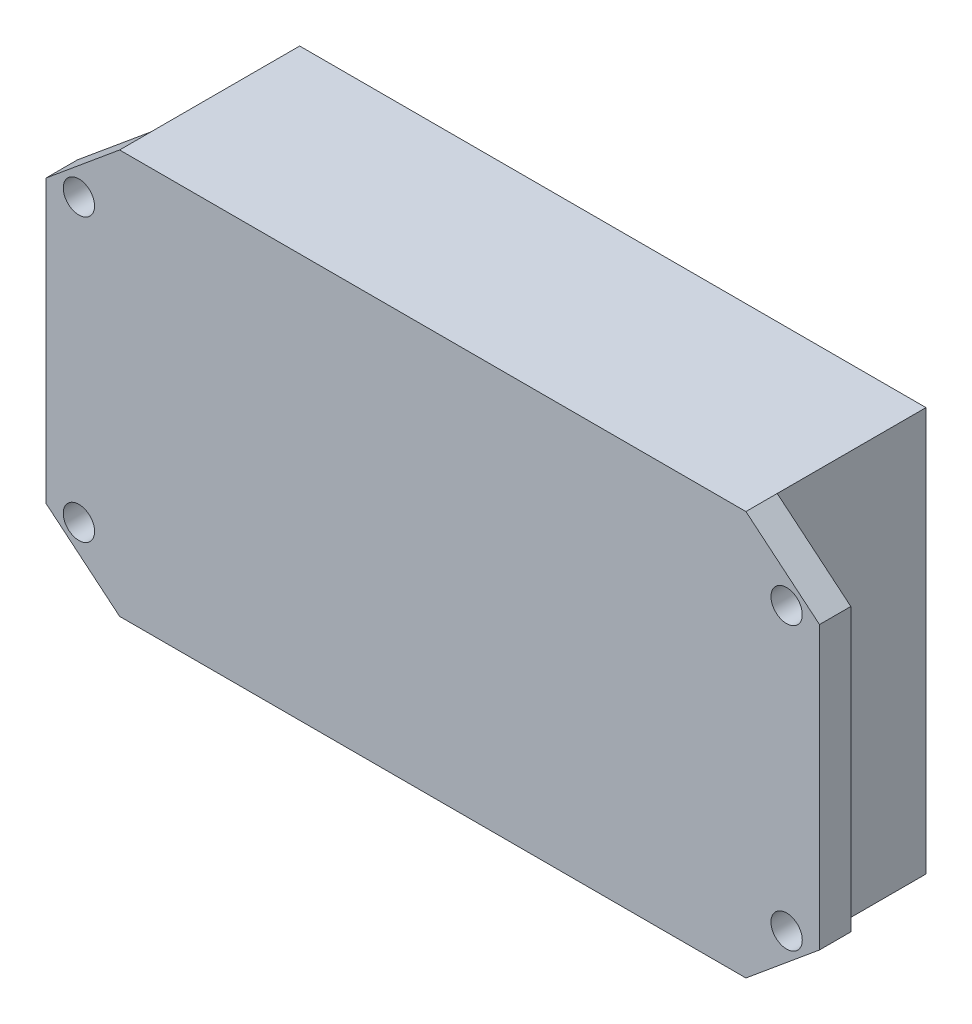
ISO-10303-21;
HEADER;
FILE_DESCRIPTION(('STEP AP214'),'2;1');
FILE_NAME('part.step','',(''),(''),'','','');
FILE_SCHEMA(('AUTOMOTIVE_DESIGN { 1 0 10303 214 1 1 1 1 }'));
ENDSEC;
DATA;
#1=APPLICATION_CONTEXT('core data for automotive mechanical design processes');
#2=APPLICATION_PROTOCOL_DEFINITION('international standard','automotive_design',2000,#1);
#3=PRODUCT_CONTEXT('',#1,'mechanical');
#4=PRODUCT('Part','Part','',(#3));
#5=PRODUCT_RELATED_PRODUCT_CATEGORY('part','',(#4));
#6=PRODUCT_DEFINITION_FORMATION('','',#4);
#7=PRODUCT_DEFINITION_CONTEXT('part definition',#1,'design');
#8=PRODUCT_DEFINITION('design','',#6,#7);
#9=PRODUCT_DEFINITION_SHAPE('','',#8);
#10=(LENGTH_UNIT() NAMED_UNIT(*) SI_UNIT(.MILLI.,.METRE.));
#11=(NAMED_UNIT(*) PLANE_ANGLE_UNIT() SI_UNIT($,.RADIAN.));
#12=(NAMED_UNIT(*) SI_UNIT($,.STERADIAN.) SOLID_ANGLE_UNIT());
#13=UNCERTAINTY_MEASURE_WITH_UNIT(LENGTH_MEASURE(1.E-05),#10,'distance_accuracy_value','');
#14=(GEOMETRIC_REPRESENTATION_CONTEXT(3) GLOBAL_UNCERTAINTY_ASSIGNED_CONTEXT((#13)) GLOBAL_UNIT_ASSIGNED_CONTEXT((#10,
#11,#12)) REPRESENTATION_CONTEXT('',''));
#15=CARTESIAN_POINT('',(0.,0.,0.));
#16=DIRECTION('',(0.,0.,1.));
#17=DIRECTION('',(1.,0.,0.));
#18=AXIS2_PLACEMENT_3D('',#15,#16,#17);
#19=CARTESIAN_POINT('',(20.,12.9,9.5));
#20=DIRECTION('',(-1.,0.,0.));
#21=DIRECTION('',(0.,0.,1.));
#22=AXIS2_PLACEMENT_3D('',#19,#20,#21);
#23=PLANE('',#22);
#24=DIRECTION('',(0.,1.,0.));
#25=VECTOR('',#24,1.);
#26=CARTESIAN_POINT('',(20.,12.9,0.));
#27=LINE('',#26,#25);
#28=CARTESIAN_POINT('',(20.,-12.9,0.));
#29=VERTEX_POINT('',#28);
#30=CARTESIAN_POINT('',(20.,12.9,0.));
#31=VERTEX_POINT('',#30);
#32=EDGE_CURVE('E146',#29,#31,#27,.T.);
#33=ORIENTED_EDGE('',*,*,#32,.T.);
#34=DIRECTION('',(0.,0.,-1.));
#35=VECTOR('',#34,1.);
#36=CARTESIAN_POINT('',(20.,12.9,9.5));
#37=LINE('',#36,#35);
#38=CARTESIAN_POINT('',(20.,12.9,9.5));
#39=VERTEX_POINT('',#38);
#40=EDGE_CURVE('E11',#39,#31,#37,.T.);
#41=ORIENTED_EDGE('',*,*,#40,.F.);
#42=DIRECTION('',(0.,1.,0.));
#43=VECTOR('',#42,1.);
#44=CARTESIAN_POINT('',(20.,12.9,9.5));
#45=LINE('',#44,#43);
#46=CARTESIAN_POINT('',(20.,-12.9,9.5));
#47=VERTEX_POINT('',#46);
#48=EDGE_CURVE('E154',#47,#39,#45,.T.);
#49=ORIENTED_EDGE('',*,*,#48,.F.);
#50=DIRECTION('',(0.,0.,-1.));
#51=VECTOR('',#50,1.);
#52=CARTESIAN_POINT('',(20.,-12.9,9.5));
#53=LINE('',#52,#51);
#54=EDGE_CURVE('E53',#47,#29,#53,.T.);
#55=ORIENTED_EDGE('',*,*,#54,.T.);
#56=EDGE_LOOP('',(#33,#41,#49,#55));
#57=FACE_BOUND('',#56,.T.);
#58=ADVANCED_FACE('F37',(#57),#23,.F.);
#59=CARTESIAN_POINT('',(-20.,12.9,9.5));
#60=DIRECTION('',(0.,-1.,0.));
#61=DIRECTION('',(0.,0.,-1.));
#62=AXIS2_PLACEMENT_3D('',#59,#60,#61);
#63=PLANE('',#62);
#64=DIRECTION('',(-1.,0.,0.));
#65=VECTOR('',#64,1.);
#66=CARTESIAN_POINT('',(-20.,12.9,0.));
#67=LINE('',#66,#65);
#68=CARTESIAN_POINT('',(-20.,12.9,0.));
#69=VERTEX_POINT('',#68);
#70=EDGE_CURVE('E148',#31,#69,#67,.T.);
#71=ORIENTED_EDGE('',*,*,#70,.T.);
#72=DIRECTION('',(0.,0.,-1.));
#73=VECTOR('',#72,1.);
#74=CARTESIAN_POINT('',(-20.,12.9,9.5));
#75=LINE('',#74,#73);
#76=CARTESIAN_POINT('',(-20.,12.9,9.5));
#77=VERTEX_POINT('',#76);
#78=EDGE_CURVE('E45',#77,#69,#75,.T.);
#79=ORIENTED_EDGE('',*,*,#78,.F.);
#80=DIRECTION('',(0.,0.,-1.));
#81=VECTOR('',#80,1.);
#82=CARTESIAN_POINT('',(-20.,12.9,11.5));
#83=LINE('',#82,#81);
#84=CARTESIAN_POINT('',(-20.,12.9,11.5));
#85=VERTEX_POINT('',#84);
#86=EDGE_CURVE('E198',#85,#77,#83,.T.);
#87=ORIENTED_EDGE('',*,*,#86,.F.);
#88=DIRECTION('',(-1.,0.,0.));
#89=VECTOR('',#88,1.);
#90=CARTESIAN_POINT('',(-20.,12.9,11.5));
#91=LINE('',#90,#89);
#92=CARTESIAN_POINT('',(20.,12.9,11.5));
#93=VERTEX_POINT('',#92);
#94=EDGE_CURVE('E137',#93,#85,#91,.T.);
#95=ORIENTED_EDGE('',*,*,#94,.F.);
#96=DIRECTION('',(0.,0.,-1.));
#97=VECTOR('',#96,1.);
#98=CARTESIAN_POINT('',(20.,12.9,11.5));
#99=LINE('',#98,#97);
#100=EDGE_CURVE('E200',#93,#39,#99,.T.);
#101=ORIENTED_EDGE('',*,*,#100,.T.);
#102=ORIENTED_EDGE('',*,*,#40,.T.);
#103=EDGE_LOOP('',(#71,#79,#87,#95,#101,#102));
#104=FACE_BOUND('',#103,.T.);
#105=ADVANCED_FACE('F265',(#104),#63,.F.);
#106=CARTESIAN_POINT('',(-20.,12.9,9.5));
#107=DIRECTION('',(1.,0.,0.));
#108=DIRECTION('',(0.,1.,0.));
#109=AXIS2_PLACEMENT_3D('',#106,#107,#108);
#110=PLANE('',#109);
#111=DIRECTION('',(0.,-1.,0.));
#112=VECTOR('',#111,1.);
#113=CARTESIAN_POINT('',(-20.,12.9,0.));
#114=LINE('',#113,#112);
#115=CARTESIAN_POINT('',(-20.,-12.9,0.));
#116=VERTEX_POINT('',#115);
#117=EDGE_CURVE('E72',#69,#116,#114,.T.);
#118=ORIENTED_EDGE('',*,*,#117,.T.);
#119=DIRECTION('',(0.,0.,-1.));
#120=VECTOR('',#119,1.);
#121=CARTESIAN_POINT('',(-20.,-12.9,9.5));
#122=LINE('',#121,#120);
#123=CARTESIAN_POINT('',(-20.,-12.9,9.5));
#124=VERTEX_POINT('',#123);
#125=EDGE_CURVE('E163',#124,#116,#122,.T.);
#126=ORIENTED_EDGE('',*,*,#125,.F.);
#127=DIRECTION('',(0.,-1.,0.));
#128=VECTOR('',#127,1.);
#129=CARTESIAN_POINT('',(-20.,12.9,9.5));
#130=LINE('',#129,#128);
#131=EDGE_CURVE('E156',#77,#124,#130,.T.);
#132=ORIENTED_EDGE('',*,*,#131,.F.);
#133=ORIENTED_EDGE('',*,*,#78,.T.);
#134=EDGE_LOOP('',(#118,#126,#132,#133));
#135=FACE_BOUND('',#134,.T.);
#136=ADVANCED_FACE('F165',(#135),#110,.F.);
#137=CARTESIAN_POINT('',(-20.,-12.9,9.5));
#138=DIRECTION('',(0.,1.,0.));
#139=DIRECTION('',(0.,0.,1.));
#140=AXIS2_PLACEMENT_3D('',#137,#138,#139);
#141=PLANE('',#140);
#142=DIRECTION('',(1.,0.,0.));
#143=VECTOR('',#142,1.);
#144=CARTESIAN_POINT('',(-20.,-12.9,0.));
#145=LINE('',#144,#143);
#146=EDGE_CURVE('E75',#116,#29,#145,.T.);
#147=ORIENTED_EDGE('',*,*,#146,.T.);
#148=ORIENTED_EDGE('',*,*,#54,.F.);
#149=DIRECTION('',(0.,0.,-1.));
#150=VECTOR('',#149,1.);
#151=CARTESIAN_POINT('',(20.,-12.9,11.5));
#152=LINE('',#151,#150);
#153=CARTESIAN_POINT('',(20.,-12.9,11.5));
#154=VERTEX_POINT('',#153);
#155=EDGE_CURVE('E177',#154,#47,#152,.T.);
#156=ORIENTED_EDGE('',*,*,#155,.F.);
#157=DIRECTION('',(1.,0.,0.));
#158=VECTOR('',#157,1.);
#159=CARTESIAN_POINT('',(-20.,-12.9,11.5));
#160=LINE('',#159,#158);
#161=CARTESIAN_POINT('',(-20.,-12.9,11.5));
#162=VERTEX_POINT('',#161);
#163=EDGE_CURVE('E209',#162,#154,#160,.T.);
#164=ORIENTED_EDGE('',*,*,#163,.F.);
#165=DIRECTION('',(0.,0.,-1.));
#166=VECTOR('',#165,1.);
#167=CARTESIAN_POINT('',(-20.,-12.9,11.5));
#168=LINE('',#167,#166);
#169=EDGE_CURVE('E150',#162,#124,#168,.T.);
#170=ORIENTED_EDGE('',*,*,#169,.T.);
#171=ORIENTED_EDGE('',*,*,#125,.T.);
#172=EDGE_LOOP('',(#147,#148,#156,#164,#170,#171));
#173=FACE_BOUND('',#172,.T.);
#174=ADVANCED_FACE('F208',(#173),#141,.F.);
#175=CARTESIAN_POINT('',(0.,0.,0.));
#176=DIRECTION('',(0.,0.,1.));
#177=DIRECTION('',(1.,0.,0.));
#178=AXIS2_PLACEMENT_3D('',#175,#176,#177);
#179=PLANE('',#178);
#180=ORIENTED_EDGE('',*,*,#32,.F.);
#181=ORIENTED_EDGE('',*,*,#146,.F.);
#182=ORIENTED_EDGE('',*,*,#117,.F.);
#183=ORIENTED_EDGE('',*,*,#70,.F.);
#184=EDGE_LOOP('',(#180,#181,#182,#183));
#185=FACE_BOUND('',#184,.T.);
#186=ADVANCED_FACE('F169',(#185),#179,.F.);
#187=CARTESIAN_POINT('',(0.,0.,9.5));
#188=DIRECTION('',(0.,0.,-1.));
#189=DIRECTION('',(-1.,0.,0.));
#190=AXIS2_PLACEMENT_3D('',#187,#188,#189);
#191=PLANE('',#190);
#192=CARTESIAN_POINT('',(22.6,9.,9.5));
#193=DIRECTION('',(0.,0.,1.));
#194=DIRECTION('',(-1.,0.,0.));
#195=AXIS2_PLACEMENT_3D('',#192,#193,#194);
#196=CIRCLE('',#195,0.999999999999998);
#197=CARTESIAN_POINT('',(21.6,9.,9.5));
#198=VERTEX_POINT('',#197);
#199=EDGE_CURVE('E233',#198,#198,#196,.T.);
#200=ORIENTED_EDGE('',*,*,#199,.T.);
#201=EDGE_LOOP('',(#200));
#202=FACE_BOUND('',#201,.T.);
#203=CARTESIAN_POINT('',(22.6,-9.,9.5));
#204=DIRECTION('',(0.,0.,1.));
#205=DIRECTION('',(1.,0.,0.));
#206=AXIS2_PLACEMENT_3D('',#203,#204,#205);
#207=CIRCLE('',#206,0.999999999999998);
#208=CARTESIAN_POINT('',(23.6,-9.,9.5));
#209=VERTEX_POINT('',#208);
#210=EDGE_CURVE('E239',#209,#209,#207,.T.);
#211=ORIENTED_EDGE('',*,*,#210,.T.);
#212=EDGE_LOOP('',(#211));
#213=FACE_BOUND('',#212,.T.);
#214=DIRECTION('',(0.769561694130098,0.638572469597315,0.));
#215=VECTOR('',#214,1.);
#216=CARTESIAN_POINT('',(20.,-12.9,9.5));
#217=LINE('',#216,#215);
#218=CARTESIAN_POINT('',(24.7,-9.,9.5));
#219=VERTEX_POINT('',#218);
#220=EDGE_CURVE('E180',#47,#219,#217,.T.);
#221=ORIENTED_EDGE('',*,*,#220,.F.);
#222=ORIENTED_EDGE('',*,*,#48,.T.);
#223=DIRECTION('',(-0.769561694130098,0.638572469597315,0.));
#224=VECTOR('',#223,1.);
#225=CARTESIAN_POINT('',(20.,12.9,9.5));
#226=LINE('',#225,#224);
#227=CARTESIAN_POINT('',(24.7,9.,9.5));
#228=VERTEX_POINT('',#227);
#229=EDGE_CURVE('E141',#228,#39,#226,.T.);
#230=ORIENTED_EDGE('',*,*,#229,.F.);
#231=DIRECTION('',(0.,1.,0.));
#232=VECTOR('',#231,1.);
#233=CARTESIAN_POINT('',(24.7,9.,9.5));
#234=LINE('',#233,#232);
#235=EDGE_CURVE('E188',#219,#228,#234,.T.);
#236=ORIENTED_EDGE('',*,*,#235,.F.);
#237=EDGE_LOOP('',(#221,#222,#230,#236));
#238=FACE_BOUND('',#237,.T.);
#239=ADVANCED_FACE('F187',(#202,#213,#238),#191,.T.);
#240=CARTESIAN_POINT('',(0.,0.,11.5));
#241=DIRECTION('',(0.,0.,-1.));
#242=DIRECTION('',(-1.,0.,0.));
#243=AXIS2_PLACEMENT_3D('',#240,#241,#242);
#244=PLANE('',#243);
#245=DIRECTION('',(-0.769561694130098,-0.638572469597315,0.));
#246=VECTOR('',#245,1.);
#247=CARTESIAN_POINT('',(-20.,12.9,11.5));
#248=LINE('',#247,#246);
#249=CARTESIAN_POINT('',(-24.7,9.,11.5));
#250=VERTEX_POINT('',#249);
#251=EDGE_CURVE('E131',#85,#250,#248,.T.);
#252=ORIENTED_EDGE('',*,*,#251,.T.);
#253=DIRECTION('',(0.,-1.,0.));
#254=VECTOR('',#253,1.);
#255=CARTESIAN_POINT('',(-24.7,9.,11.5));
#256=LINE('',#255,#254);
#257=CARTESIAN_POINT('',(-24.7,-9.,11.5));
#258=VERTEX_POINT('',#257);
#259=EDGE_CURVE('E120',#250,#258,#256,.T.);
#260=ORIENTED_EDGE('',*,*,#259,.T.);
#261=DIRECTION('',(0.769561694130098,-0.638572469597315,0.));
#262=VECTOR('',#261,1.);
#263=CARTESIAN_POINT('',(-20.,-12.9,11.5));
#264=LINE('',#263,#262);
#265=EDGE_CURVE('E130',#258,#162,#264,.T.);
#266=ORIENTED_EDGE('',*,*,#265,.T.);
#267=ORIENTED_EDGE('',*,*,#163,.T.);
#268=DIRECTION('',(0.769561694130098,0.638572469597315,0.));
#269=VECTOR('',#268,1.);
#270=CARTESIAN_POINT('',(20.,-12.9,11.5));
#271=LINE('',#270,#269);
#272=CARTESIAN_POINT('',(24.7,-9.,11.5));
#273=VERTEX_POINT('',#272);
#274=EDGE_CURVE('E182',#154,#273,#271,.T.);
#275=ORIENTED_EDGE('',*,*,#274,.T.);
#276=DIRECTION('',(0.,1.,0.));
#277=VECTOR('',#276,1.);
#278=CARTESIAN_POINT('',(24.7,9.,11.5));
#279=LINE('',#278,#277);
#280=CARTESIAN_POINT('',(24.7,9.,11.5));
#281=VERTEX_POINT('',#280);
#282=EDGE_CURVE('E225',#273,#281,#279,.T.);
#283=ORIENTED_EDGE('',*,*,#282,.T.);
#284=DIRECTION('',(-0.769561694130098,0.638572469597315,0.));
#285=VECTOR('',#284,1.);
#286=CARTESIAN_POINT('',(20.,12.9,11.5));
#287=LINE('',#286,#285);
#288=EDGE_CURVE('E223',#281,#93,#287,.T.);
#289=ORIENTED_EDGE('',*,*,#288,.T.);
#290=ORIENTED_EDGE('',*,*,#94,.T.);
#291=EDGE_LOOP('',(#252,#260,#266,#267,#275,#283,#289,#290));
#292=FACE_BOUND('',#291,.T.);
#293=CARTESIAN_POINT('',(-22.6,9.,11.5));
#294=DIRECTION('',(0.,0.,1.));
#295=DIRECTION('',(1.,0.,0.));
#296=AXIS2_PLACEMENT_3D('',#293,#294,#295);
#297=CIRCLE('',#296,0.999999999999998);
#298=CARTESIAN_POINT('',(-21.6,9.,11.5));
#299=VERTEX_POINT('',#298);
#300=EDGE_CURVE('E216',#299,#299,#297,.T.);
#301=ORIENTED_EDGE('',*,*,#300,.F.);
#302=EDGE_LOOP('',(#301));
#303=FACE_BOUND('',#302,.T.);
#304=CARTESIAN_POINT('',(22.6,9.,11.5));
#305=DIRECTION('',(0.,0.,1.));
#306=DIRECTION('',(-1.,0.,0.));
#307=AXIS2_PLACEMENT_3D('',#304,#305,#306);
#308=CIRCLE('',#307,0.999999999999998);
#309=CARTESIAN_POINT('',(21.6,9.,11.5));
#310=VERTEX_POINT('',#309);
#311=EDGE_CURVE('E231',#310,#310,#308,.T.);
#312=ORIENTED_EDGE('',*,*,#311,.F.);
#313=EDGE_LOOP('',(#312));
#314=FACE_BOUND('',#313,.T.);
#315=CARTESIAN_POINT('',(22.6,-9.,11.5));
#316=DIRECTION('',(0.,0.,1.));
#317=DIRECTION('',(1.,0.,0.));
#318=AXIS2_PLACEMENT_3D('',#315,#316,#317);
#319=CIRCLE('',#318,0.999999999999998);
#320=CARTESIAN_POINT('',(23.6,-9.,11.5));
#321=VERTEX_POINT('',#320);
#322=EDGE_CURVE('E236',#321,#321,#319,.T.);
#323=ORIENTED_EDGE('',*,*,#322,.F.);
#324=EDGE_LOOP('',(#323));
#325=FACE_BOUND('',#324,.T.);
#326=CARTESIAN_POINT('',(-22.6,-9.,11.5));
#327=DIRECTION('',(0.,0.,1.));
#328=DIRECTION('',(-1.,0.,0.));
#329=AXIS2_PLACEMENT_3D('',#326,#327,#328);
#330=CIRCLE('',#329,0.999999999999998);
#331=CARTESIAN_POINT('',(-23.6,-9.,11.5));
#332=VERTEX_POINT('',#331);
#333=EDGE_CURVE('E242',#332,#332,#330,.T.);
#334=ORIENTED_EDGE('',*,*,#333,.F.);
#335=EDGE_LOOP('',(#334));
#336=FACE_BOUND('',#335,.T.);
#337=ADVANCED_FACE('F134',(#292,#303,#314,#325,#336),#244,.F.);
#338=CARTESIAN_POINT('',(-22.6,9.,9.5));
#339=DIRECTION('',(0.,0.,1.));
#340=DIRECTION('',(1.,0.,0.));
#341=AXIS2_PLACEMENT_3D('',#338,#339,#340);
#342=CIRCLE('',#341,0.999999999999998);
#343=CARTESIAN_POINT('',(-21.6,9.,9.5));
#344=VERTEX_POINT('',#343);
#345=EDGE_CURVE('E219',#344,#344,#342,.T.);
#346=ORIENTED_EDGE('',*,*,#345,.T.);
#347=EDGE_LOOP('',(#346));
#348=FACE_BOUND('',#347,.T.);
#349=DIRECTION('',(-0.769561694130098,-0.638572469597315,0.));
#350=VECTOR('',#349,1.);
#351=CARTESIAN_POINT('',(-20.,12.9,9.5));
#352=LINE('',#351,#350);
#353=CARTESIAN_POINT('',(-24.7,9.,9.5));
#354=VERTEX_POINT('',#353);
#355=EDGE_CURVE('E145',#77,#354,#352,.T.);
#356=ORIENTED_EDGE('',*,*,#355,.F.);
#357=ORIENTED_EDGE('',*,*,#131,.T.);
#358=DIRECTION('',(0.769561694130098,-0.638572469597315,0.));
#359=VECTOR('',#358,1.);
#360=CARTESIAN_POINT('',(-20.,-12.9,9.5));
#361=LINE('',#360,#359);
#362=CARTESIAN_POINT('',(-24.7,-9.,9.5));
#363=VERTEX_POINT('',#362);
#364=EDGE_CURVE('E189',#363,#124,#361,.T.);
#365=ORIENTED_EDGE('',*,*,#364,.F.);
#366=DIRECTION('',(0.,-1.,0.));
#367=VECTOR('',#366,1.);
#368=CARTESIAN_POINT('',(-24.7,9.,9.5));
#369=LINE('',#368,#367);
#370=EDGE_CURVE('E193',#354,#363,#369,.T.);
#371=ORIENTED_EDGE('',*,*,#370,.F.);
#372=EDGE_LOOP('',(#356,#357,#365,#371));
#373=FACE_BOUND('',#372,.T.);
#374=CARTESIAN_POINT('',(-22.6,-9.,9.5));
#375=DIRECTION('',(0.,0.,1.));
#376=DIRECTION('',(-1.,0.,0.));
#377=AXIS2_PLACEMENT_3D('',#374,#375,#376);
#378=CIRCLE('',#377,0.999999999999998);
#379=CARTESIAN_POINT('',(-23.6,-9.,9.5));
#380=VERTEX_POINT('',#379);
#381=EDGE_CURVE('E245',#380,#380,#378,.T.);
#382=ORIENTED_EDGE('',*,*,#381,.T.);
#383=EDGE_LOOP('',(#382));
#384=FACE_BOUND('',#383,.T.);
#385=ADVANCED_FACE('F214',(#348,#373,#384),#191,.T.);
#386=CARTESIAN_POINT('',(-20.,12.9,11.5));
#387=DIRECTION('',(0.638572469597315,-0.769561694130098,0.));
#388=DIRECTION('',(0.769561694130098,0.638572469597315,0.));
#389=AXIS2_PLACEMENT_3D('',#386,#387,#388);
#390=PLANE('',#389);
#391=ORIENTED_EDGE('',*,*,#355,.T.);
#392=DIRECTION('',(0.,0.,-1.));
#393=VECTOR('',#392,1.);
#394=CARTESIAN_POINT('',(-24.7,9.,11.5));
#395=LINE('',#394,#393);
#396=EDGE_CURVE('E124',#250,#354,#395,.T.);
#397=ORIENTED_EDGE('',*,*,#396,.F.);
#398=ORIENTED_EDGE('',*,*,#251,.F.);
#399=ORIENTED_EDGE('',*,*,#86,.T.);
#400=EDGE_LOOP('',(#391,#397,#398,#399));
#401=FACE_BOUND('',#400,.T.);
#402=ADVANCED_FACE('F143',(#401),#390,.F.);
#403=CARTESIAN_POINT('',(-24.7,9.,11.5));
#404=DIRECTION('',(1.,0.,0.));
#405=DIRECTION('',(0.,0.,-1.));
#406=AXIS2_PLACEMENT_3D('',#403,#404,#405);
#407=PLANE('',#406);
#408=ORIENTED_EDGE('',*,*,#370,.T.);
#409=DIRECTION('',(0.,0.,-1.));
#410=VECTOR('',#409,1.);
#411=CARTESIAN_POINT('',(-24.7,-9.,11.5));
#412=LINE('',#411,#410);
#413=EDGE_CURVE('E127',#258,#363,#412,.T.);
#414=ORIENTED_EDGE('',*,*,#413,.F.);
#415=ORIENTED_EDGE('',*,*,#259,.F.);
#416=ORIENTED_EDGE('',*,*,#396,.T.);
#417=EDGE_LOOP('',(#408,#414,#415,#416));
#418=FACE_BOUND('',#417,.T.);
#419=ADVANCED_FACE('F122',(#418),#407,.F.);
#420=CARTESIAN_POINT('',(-20.,-12.9,11.5));
#421=DIRECTION('',(0.638572469597315,0.769561694130098,0.));
#422=DIRECTION('',(-0.769561694130098,0.638572469597315,0.));
#423=AXIS2_PLACEMENT_3D('',#420,#421,#422);
#424=PLANE('',#423);
#425=ORIENTED_EDGE('',*,*,#364,.T.);
#426=ORIENTED_EDGE('',*,*,#169,.F.);
#427=ORIENTED_EDGE('',*,*,#265,.F.);
#428=ORIENTED_EDGE('',*,*,#413,.T.);
#429=EDGE_LOOP('',(#425,#426,#427,#428));
#430=FACE_BOUND('',#429,.T.);
#431=ADVANCED_FACE('F211',(#430),#424,.F.);
#432=CARTESIAN_POINT('',(20.,-12.9,11.5));
#433=DIRECTION('',(-0.638572469597315,0.769561694130098,0.));
#434=DIRECTION('',(-0.769561694130098,-0.638572469597315,0.));
#435=AXIS2_PLACEMENT_3D('',#432,#433,#434);
#436=PLANE('',#435);
#437=ORIENTED_EDGE('',*,*,#220,.T.);
#438=DIRECTION('',(0.,0.,-1.));
#439=VECTOR('',#438,1.);
#440=CARTESIAN_POINT('',(24.7,-9.,11.5));
#441=LINE('',#440,#439);
#442=EDGE_CURVE('E184',#273,#219,#441,.T.);
#443=ORIENTED_EDGE('',*,*,#442,.F.);
#444=ORIENTED_EDGE('',*,*,#274,.F.);
#445=ORIENTED_EDGE('',*,*,#155,.T.);
#446=EDGE_LOOP('',(#437,#443,#444,#445));
#447=FACE_BOUND('',#446,.T.);
#448=ADVANCED_FACE('F178',(#447),#436,.F.);
#449=CARTESIAN_POINT('',(24.7,9.,11.5));
#450=DIRECTION('',(-1.,0.,0.));
#451=DIRECTION('',(0.,0.,1.));
#452=AXIS2_PLACEMENT_3D('',#449,#450,#451);
#453=PLANE('',#452);
#454=ORIENTED_EDGE('',*,*,#235,.T.);
#455=DIRECTION('',(0.,0.,-1.));
#456=VECTOR('',#455,1.);
#457=CARTESIAN_POINT('',(24.7,9.,11.5));
#458=LINE('',#457,#456);
#459=EDGE_CURVE('E203',#281,#228,#458,.T.);
#460=ORIENTED_EDGE('',*,*,#459,.F.);
#461=ORIENTED_EDGE('',*,*,#282,.F.);
#462=ORIENTED_EDGE('',*,*,#442,.T.);
#463=EDGE_LOOP('',(#454,#460,#461,#462));
#464=FACE_BOUND('',#463,.T.);
#465=ADVANCED_FACE('F286',(#464),#453,.F.);
#466=CARTESIAN_POINT('',(20.,12.9,11.5));
#467=DIRECTION('',(-0.638572469597315,-0.769561694130098,0.));
#468=DIRECTION('',(0.769561694130098,-0.638572469597315,0.));
#469=AXIS2_PLACEMENT_3D('',#466,#467,#468);
#470=PLANE('',#469);
#471=ORIENTED_EDGE('',*,*,#229,.T.);
#472=ORIENTED_EDGE('',*,*,#100,.F.);
#473=ORIENTED_EDGE('',*,*,#288,.F.);
#474=ORIENTED_EDGE('',*,*,#459,.T.);
#475=EDGE_LOOP('',(#471,#472,#473,#474));
#476=FACE_BOUND('',#475,.T.);
#477=ADVANCED_FACE('F289',(#476),#470,.F.);
#478=CARTESIAN_POINT('',(-22.6,9.,11.5));
#479=DIRECTION('',(0.,0.,-1.));
#480=DIRECTION('',(-1.,0.,0.));
#481=AXIS2_PLACEMENT_3D('',#478,#479,#480);
#482=CYLINDRICAL_SURFACE('',#481,0.999999999999998);
#483=ORIENTED_EDGE('',*,*,#300,.T.);
#484=EDGE_LOOP('',(#483));
#485=FACE_BOUND('',#484,.T.);
#486=ORIENTED_EDGE('',*,*,#345,.F.);
#487=EDGE_LOOP('',(#486));
#488=FACE_BOUND('',#487,.T.);
#489=ADVANCED_FACE('F292',(#485,#488),#482,.F.);
#490=CARTESIAN_POINT('',(22.6,9.,11.5));
#491=DIRECTION('',(0.,0.,-1.));
#492=DIRECTION('',(-1.,0.,0.));
#493=AXIS2_PLACEMENT_3D('',#490,#491,#492);
#494=CYLINDRICAL_SURFACE('',#493,0.999999999999998);
#495=ORIENTED_EDGE('',*,*,#311,.T.);
#496=EDGE_LOOP('',(#495));
#497=FACE_BOUND('',#496,.T.);
#498=ORIENTED_EDGE('',*,*,#199,.F.);
#499=EDGE_LOOP('',(#498));
#500=FACE_BOUND('',#499,.T.);
#501=ADVANCED_FACE('F297',(#497,#500),#494,.F.);
#502=CARTESIAN_POINT('',(22.6,-9.,11.5));
#503=DIRECTION('',(0.,0.,-1.));
#504=DIRECTION('',(-1.,0.,0.));
#505=AXIS2_PLACEMENT_3D('',#502,#503,#504);
#506=CYLINDRICAL_SURFACE('',#505,0.999999999999998);
#507=ORIENTED_EDGE('',*,*,#322,.T.);
#508=EDGE_LOOP('',(#507));
#509=FACE_BOUND('',#508,.T.);
#510=ORIENTED_EDGE('',*,*,#210,.F.);
#511=EDGE_LOOP('',(#510));
#512=FACE_BOUND('',#511,.T.);
#513=ADVANCED_FACE('F306',(#509,#512),#506,.F.);
#514=CARTESIAN_POINT('',(-22.6,-9.,11.5));
#515=DIRECTION('',(0.,0.,-1.));
#516=DIRECTION('',(-1.,0.,0.));
#517=AXIS2_PLACEMENT_3D('',#514,#515,#516);
#518=CYLINDRICAL_SURFACE('',#517,0.999999999999998);
#519=ORIENTED_EDGE('',*,*,#333,.T.);
#520=EDGE_LOOP('',(#519));
#521=FACE_BOUND('',#520,.T.);
#522=ORIENTED_EDGE('',*,*,#381,.F.);
#523=EDGE_LOOP('',(#522));
#524=FACE_BOUND('',#523,.T.);
#525=ADVANCED_FACE('F251',(#521,#524),#518,.F.);
#526=CLOSED_SHELL('',(#58,#105,#136,#174,#186,#239,#337,#385,#402,#419,#431,#448,#465,#477,#489,
#501,#513,#525));
#527=MANIFOLD_SOLID_BREP('B2',#526);
#528=ADVANCED_BREP_SHAPE_REPRESENTATION('',(#18,#527),#14);
#529=SHAPE_DEFINITION_REPRESENTATION(#9,#528);
ENDSEC;
END-ISO-10303-21;
